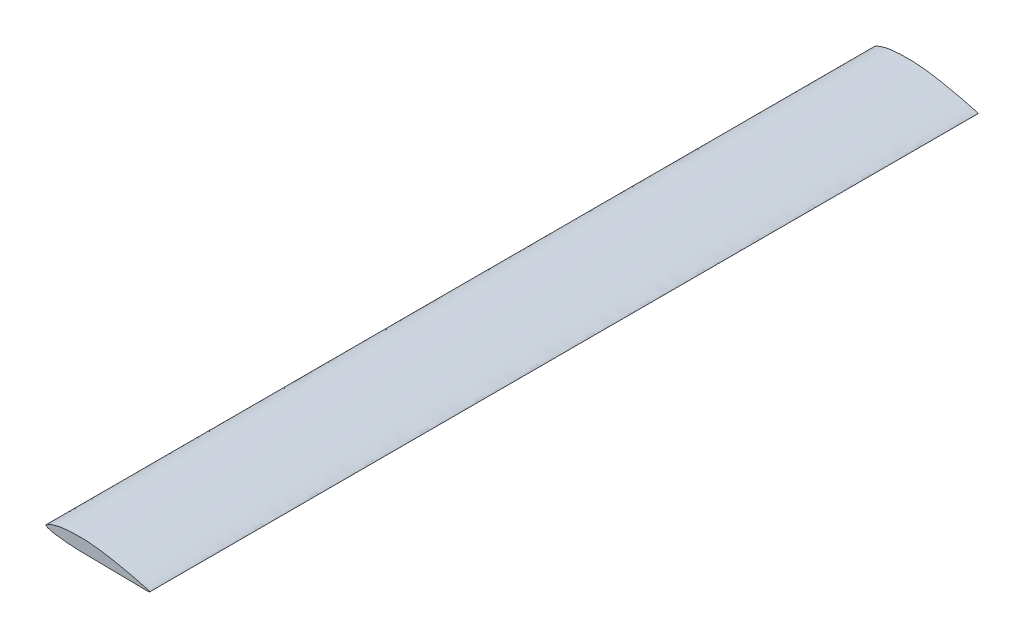
ISO-10303-21;
HEADER;
FILE_DESCRIPTION(('STEP AP214'),'2;1');
FILE_NAME('part.step','',(''),(''),'','','');
FILE_SCHEMA(('AUTOMOTIVE_DESIGN { 1 0 10303 214 1 1 1 1 }'));
ENDSEC;
DATA;
#1=APPLICATION_CONTEXT('core data for automotive mechanical design processes');
#2=APPLICATION_PROTOCOL_DEFINITION('international standard','automotive_design',2000,#1);
#3=PRODUCT_CONTEXT('',#1,'mechanical');
#4=PRODUCT('Part','Part','',(#3));
#5=PRODUCT_RELATED_PRODUCT_CATEGORY('part','',(#4));
#6=PRODUCT_DEFINITION_FORMATION('','',#4);
#7=PRODUCT_DEFINITION_CONTEXT('part definition',#1,'design');
#8=PRODUCT_DEFINITION('design','',#6,#7);
#9=PRODUCT_DEFINITION_SHAPE('','',#8);
#10=(LENGTH_UNIT() NAMED_UNIT(*) SI_UNIT(.MILLI.,.METRE.));
#11=(NAMED_UNIT(*) PLANE_ANGLE_UNIT() SI_UNIT($,.RADIAN.));
#12=(NAMED_UNIT(*) SI_UNIT($,.STERADIAN.) SOLID_ANGLE_UNIT());
#13=UNCERTAINTY_MEASURE_WITH_UNIT(LENGTH_MEASURE(1.E-05),#10,'distance_accuracy_value','');
#14=(GEOMETRIC_REPRESENTATION_CONTEXT(3) GLOBAL_UNCERTAINTY_ASSIGNED_CONTEXT((#13)) GLOBAL_UNIT_ASSIGNED_CONTEXT((#10,
#11,#12)) REPRESENTATION_CONTEXT('',''));
#15=CARTESIAN_POINT('',(0.,0.,0.));
#16=DIRECTION('',(0.,0.,1.));
#17=DIRECTION('',(1.,0.,0.));
#18=AXIS2_PLACEMENT_3D('',#15,#16,#17);
#19=CARTESIAN_POINT('',(-65.8626147770017,69.2240756889103,-800.));
#20=CARTESIAN_POINT('',(-64.9625087237922,67.7474300418043,-800.));
#21=CARTESIAN_POINT('',(-52.8424703043298,63.9957410147237,-800.));
#22=CARTESIAN_POINT('',(-34.9777629239484,61.6323877226629,-800.));
#23=CARTESIAN_POINT('',(-6.71642944157596,59.1799010342569,-800.));
#24=CARTESIAN_POINT('',(27.0236733360579,59.3365705027516,-800.));
#25=CARTESIAN_POINT('',(70.6128970369961,58.3540838857652,-800.));
#26=CARTESIAN_POINT('',(98.4690074298016,58.1513694707483,-800.));
#27=CARTESIAN_POINT('',(144.96628461872,57.1606258822769,-800.));
#28=CARTESIAN_POINT('',(105.095596541495,67.394078381385,-800.));
#29=CARTESIAN_POINT('',(85.3281681760405,71.6331807899108,-800.));
#30=CARTESIAN_POINT('',(56.1203215750449,77.8212637027336,-800.));
#31=CARTESIAN_POINT('',(28.5532203260582,81.9578630838473,-800.));
#32=CARTESIAN_POINT('',(1.21583297961248,83.7506783941906,-800.));
#33=CARTESIAN_POINT('',(-26.8738881520975,82.2444478135679,-800.));
#34=CARTESIAN_POINT('',(-44.3624244936479,80.2864518061994,-800.));
#35=CARTESIAN_POINT('',(-67.5568839226954,72.0035650058569,-800.));
#36=CARTESIAN_POINT('',(-65.8626147770017,69.2240756889103,-800.));
#37=B_SPLINE_CURVE_WITH_KNOTS('',3,(#19,#20,#21,#22,#23,#24,#25,#26,#27,#28,#29,#30,#31,#32,#33,
#34,#35,#36),.UNSPECIFIED.,.T.,.F.,(4,1,1,1,1,1,1,1,1,1,1,1,1,1,1,4),(0.,0.0232308789724133,
0.0681724203893969,0.152493186920399,0.22170632781367,0.322842540212292,0.455754792793607,
0.494865831980499,0.553687020862411,0.623496303459277,0.691563002211649,0.761042955451725,
0.831652650656755,0.895973513990827,0.956272528853726,1.),.UNSPECIFIED.);
#38=DIRECTION('',(0.,0.,1.));
#39=VECTOR('',#38,1.);
#40=SURFACE_OF_LINEAR_EXTRUSION('',#37,#39);
#41=CARTESIAN_POINT('',(-65.8626147770017,69.2240756889103,-800.));
#42=VERTEX_POINT('',#41);
#43=EDGE_CURVE('E10',#42,#42,#37,.T.);
#44=ORIENTED_EDGE('',*,*,#43,.T.);
#45=EDGE_LOOP('',(#44));
#46=FACE_BOUND('',#45,.T.);
#47=CARTESIAN_POINT('',(-65.8626147770017,69.2240756889103,800.));
#48=CARTESIAN_POINT('',(-64.9625087237922,67.7474300418043,800.));
#49=CARTESIAN_POINT('',(-52.8424703043298,63.9957410147237,800.));
#50=CARTESIAN_POINT('',(-34.9777629239484,61.6323877226629,800.));
#51=CARTESIAN_POINT('',(-6.71642944157596,59.1799010342569,800.));
#52=CARTESIAN_POINT('',(27.0236733360579,59.3365705027516,800.));
#53=CARTESIAN_POINT('',(70.6128970369961,58.3540838857652,800.));
#54=CARTESIAN_POINT('',(98.4690074298016,58.1513694707483,800.));
#55=CARTESIAN_POINT('',(144.96628461872,57.1606258822769,800.));
#56=CARTESIAN_POINT('',(105.095596541495,67.394078381385,800.));
#57=CARTESIAN_POINT('',(85.3281681760405,71.6331807899108,800.));
#58=CARTESIAN_POINT('',(56.1203215750449,77.8212637027336,800.));
#59=CARTESIAN_POINT('',(28.5532203260582,81.9578630838473,800.));
#60=CARTESIAN_POINT('',(1.21583297961248,83.7506783941906,800.));
#61=CARTESIAN_POINT('',(-26.8738881520975,82.2444478135679,800.));
#62=CARTESIAN_POINT('',(-44.3624244936479,80.2864518061994,800.));
#63=CARTESIAN_POINT('',(-67.5568839226954,72.0035650058569,800.));
#64=CARTESIAN_POINT('',(-65.8626147770017,69.2240756889103,800.));
#65=B_SPLINE_CURVE_WITH_KNOTS('',3,(#47,#48,#49,#50,#51,#52,#53,#54,#55,#56,#57,#58,#59,#60,#61,
#62,#63,#64),.UNSPECIFIED.,.T.,.F.,(4,1,1,1,1,1,1,1,1,1,1,1,1,1,1,4),(0.,0.0232308789724133,
0.0681724203893969,0.152493186920399,0.22170632781367,0.322842540212292,0.455754792793607,
0.494865831980499,0.553687020862411,0.623496303459277,0.691563002211649,0.761042955451725,
0.831652650656755,0.895973513990827,0.956272528853726,1.),.UNSPECIFIED.);
#66=CARTESIAN_POINT('',(-65.8626147770017,69.2240756889103,800.));
#67=VERTEX_POINT('',#66);
#68=EDGE_CURVE('E39',#67,#67,#65,.T.);
#69=ORIENTED_EDGE('',*,*,#68,.F.);
#70=EDGE_LOOP('',(#69));
#71=FACE_BOUND('',#70,.T.);
#72=ADVANCED_FACE('F30',(#46,#71),#40,.T.);
#73=CARTESIAN_POINT('',(134.196878984617,58.6512277334751,-800.));
#74=DIRECTION('',(0.,0.,1.));
#75=DIRECTION('',(1.,0.,0.));
#76=AXIS2_PLACEMENT_3D('',#73,#74,#75);
#77=PLANE('',#76);
#78=ORIENTED_EDGE('',*,*,#43,.F.);
#79=EDGE_LOOP('',(#78));
#80=FACE_BOUND('',#79,.T.);
#81=ADVANCED_FACE('F53',(#80),#77,.F.);
#82=CARTESIAN_POINT('',(134.196878984617,58.6512277334751,800.));
#83=DIRECTION('',(0.,0.,1.));
#84=DIRECTION('',(1.,0.,0.));
#85=AXIS2_PLACEMENT_3D('',#82,#83,#84);
#86=PLANE('',#85);
#87=ORIENTED_EDGE('',*,*,#68,.T.);
#88=EDGE_LOOP('',(#87));
#89=FACE_BOUND('',#88,.T.);
#90=ADVANCED_FACE('F50',(#89),#86,.T.);
#91=CLOSED_SHELL('',(#72,#81,#90));
#92=MANIFOLD_SOLID_BREP('B2',#91);
#93=ADVANCED_BREP_SHAPE_REPRESENTATION('',(#18,#92),#14);
#94=SHAPE_DEFINITION_REPRESENTATION(#9,#93);
ENDSEC;
END-ISO-10303-21;
